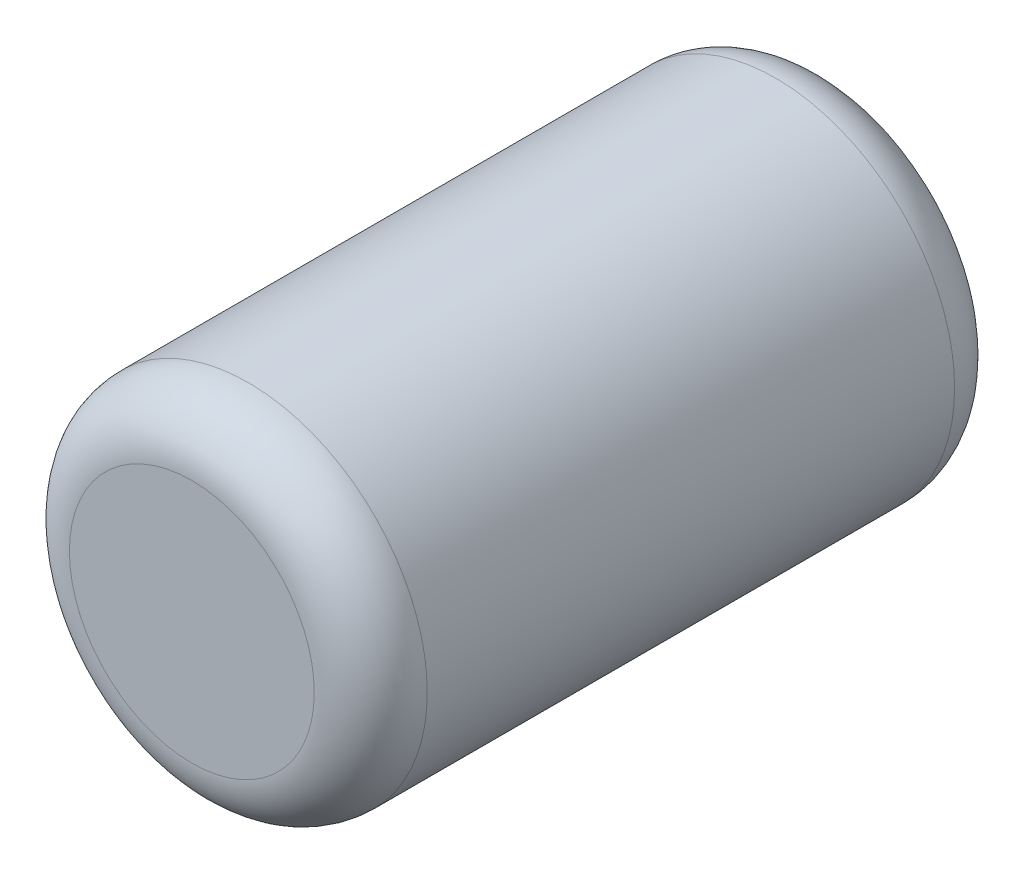
ISO-10303-21;
HEADER;
FILE_DESCRIPTION(('STEP AP214'),'2;1');
FILE_NAME('part.step','',(''),(''),'','','');
FILE_SCHEMA(('AUTOMOTIVE_DESIGN { 1 0 10303 214 1 1 1 1 }'));
ENDSEC;
DATA;
#1=APPLICATION_CONTEXT('core data for automotive mechanical design processes');
#2=APPLICATION_PROTOCOL_DEFINITION('international standard','automotive_design',2000,#1);
#3=PRODUCT_CONTEXT('',#1,'mechanical');
#4=PRODUCT('Part','Part','',(#3));
#5=PRODUCT_RELATED_PRODUCT_CATEGORY('part','',(#4));
#6=PRODUCT_DEFINITION_FORMATION('','',#4);
#7=PRODUCT_DEFINITION_CONTEXT('part definition',#1,'design');
#8=PRODUCT_DEFINITION('design','',#6,#7);
#9=PRODUCT_DEFINITION_SHAPE('','',#8);
#10=(LENGTH_UNIT() NAMED_UNIT(*) SI_UNIT(.MILLI.,.METRE.));
#11=(NAMED_UNIT(*) PLANE_ANGLE_UNIT() SI_UNIT($,.RADIAN.));
#12=(NAMED_UNIT(*) SI_UNIT($,.STERADIAN.) SOLID_ANGLE_UNIT());
#13=UNCERTAINTY_MEASURE_WITH_UNIT(LENGTH_MEASURE(1.E-05),#10,'distance_accuracy_value','');
#14=(GEOMETRIC_REPRESENTATION_CONTEXT(3) GLOBAL_UNCERTAINTY_ASSIGNED_CONTEXT((#13)) GLOBAL_UNIT_ASSIGNED_CONTEXT((#10,
#11,#12)) REPRESENTATION_CONTEXT('',''));
#15=CARTESIAN_POINT('',(0.,0.,0.));
#16=DIRECTION('',(0.,0.,1.));
#17=DIRECTION('',(1.,0.,0.));
#18=AXIS2_PLACEMENT_3D('',#15,#16,#17);
#19=CARTESIAN_POINT('',(0.,0.,34.));
#20=DIRECTION('',(0.,0.,-1.));
#21=DIRECTION('',(-1.,0.,0.));
#22=AXIS2_PLACEMENT_3D('',#19,#20,#21);
#23=CYLINDRICAL_SURFACE('',#22,9.5);
#24=CARTESIAN_POINT('',(0.,0.,31.));
#25=DIRECTION('',(0.,0.,1.));
#26=DIRECTION('',(1.,0.,0.));
#27=AXIS2_PLACEMENT_3D('',#24,#25,#26);
#28=CIRCLE('',#27,9.5);
#29=CARTESIAN_POINT('',(9.5,0.,31.));
#30=VERTEX_POINT('',#29);
#31=EDGE_CURVE('E42',#30,#30,#28,.F.);
#32=ORIENTED_EDGE('',*,*,#31,.T.);
#33=EDGE_LOOP('',(#32));
#34=FACE_BOUND('',#33,.T.);
#35=CARTESIAN_POINT('',(0.,0.,3.));
#36=DIRECTION('',(0.,0.,1.));
#37=DIRECTION('',(1.,0.,0.));
#38=AXIS2_PLACEMENT_3D('',#35,#36,#37);
#39=CIRCLE('',#38,9.5);
#40=CARTESIAN_POINT('',(9.5,0.,3.));
#41=VERTEX_POINT('',#40);
#42=EDGE_CURVE('E46',#41,#41,#39,.T.);
#43=ORIENTED_EDGE('',*,*,#42,.T.);
#44=EDGE_LOOP('',(#43));
#45=FACE_BOUND('',#44,.T.);
#46=ADVANCED_FACE('F35',(#34,#45),#23,.T.);
#47=CARTESIAN_POINT('',(0.,0.,34.));
#48=DIRECTION('',(0.,0.,1.));
#49=DIRECTION('',(1.,0.,0.));
#50=AXIS2_PLACEMENT_3D('',#47,#48,#49);
#51=PLANE('',#50);
#52=CARTESIAN_POINT('',(0.,0.,34.));
#53=DIRECTION('',(0.,0.,1.));
#54=DIRECTION('',(1.,0.,0.));
#55=AXIS2_PLACEMENT_3D('',#52,#53,#54);
#56=CIRCLE('',#55,6.5);
#57=CARTESIAN_POINT('',(6.5,0.,34.));
#58=VERTEX_POINT('',#57);
#59=EDGE_CURVE('E50',#58,#58,#56,.T.);
#60=ORIENTED_EDGE('',*,*,#59,.T.);
#61=EDGE_LOOP('',(#60));
#62=FACE_BOUND('',#61,.T.);
#63=ADVANCED_FACE('F56',(#62),#51,.T.);
#64=CARTESIAN_POINT('',(0.,0.,0.));
#65=DIRECTION('',(0.,0.,1.));
#66=DIRECTION('',(1.,0.,0.));
#67=AXIS2_PLACEMENT_3D('',#64,#65,#66);
#68=PLANE('',#67);
#69=CARTESIAN_POINT('',(0.,0.,0.));
#70=DIRECTION('',(0.,0.,1.));
#71=DIRECTION('',(1.,0.,0.));
#72=AXIS2_PLACEMENT_3D('',#69,#70,#71);
#73=CIRCLE('',#72,6.5);
#74=CARTESIAN_POINT('',(6.5,0.,0.));
#75=VERTEX_POINT('',#74);
#76=EDGE_CURVE('E10',#75,#75,#73,.F.);
#77=ORIENTED_EDGE('',*,*,#76,.T.);
#78=EDGE_LOOP('',(#77));
#79=FACE_BOUND('',#78,.T.);
#80=ADVANCED_FACE('F60',(#79),#68,.F.);
#81=CARTESIAN_POINT('',(0.,0.,31.));
#82=DIRECTION('',(0.,0.,1.));
#83=DIRECTION('',(1.,0.,0.));
#84=AXIS2_PLACEMENT_3D('',#81,#82,#83);
#85=TOROIDAL_SURFACE('',#84,6.5,3.);
#86=ORIENTED_EDGE('',*,*,#31,.F.);
#87=EDGE_LOOP('',(#86));
#88=FACE_BOUND('',#87,.T.);
#89=ORIENTED_EDGE('',*,*,#59,.F.);
#90=EDGE_LOOP('',(#89));
#91=FACE_BOUND('',#90,.T.);
#92=ADVANCED_FACE('F58',(#88,#91),#85,.T.);
#93=CARTESIAN_POINT('',(0.,0.,3.));
#94=DIRECTION('',(0.,0.,1.));
#95=DIRECTION('',(1.,0.,0.));
#96=AXIS2_PLACEMENT_3D('',#93,#94,#95);
#97=TOROIDAL_SURFACE('',#96,6.5,3.);
#98=ORIENTED_EDGE('',*,*,#76,.F.);
#99=EDGE_LOOP('',(#98));
#100=FACE_BOUND('',#99,.T.);
#101=ORIENTED_EDGE('',*,*,#42,.F.);
#102=EDGE_LOOP('',(#101));
#103=FACE_BOUND('',#102,.T.);
#104=ADVANCED_FACE('F37',(#100,#103),#97,.T.);
#105=CLOSED_SHELL('',(#46,#63,#80,#92,#104));
#106=MANIFOLD_SOLID_BREP('B2',#105);
#107=ADVANCED_BREP_SHAPE_REPRESENTATION('',(#18,#106),#14);
#108=SHAPE_DEFINITION_REPRESENTATION(#9,#107);
ENDSEC;
END-ISO-10303-21;
